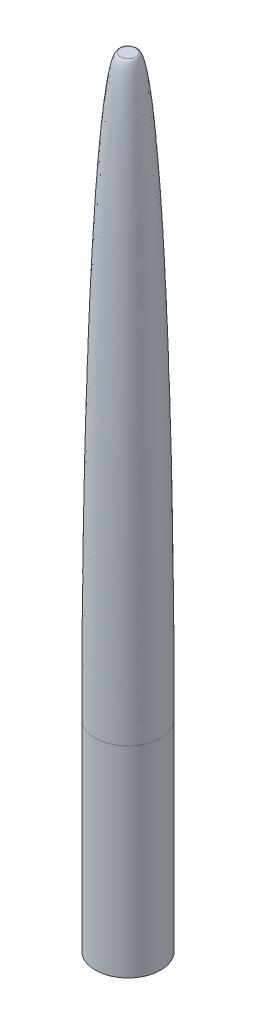
ISO-10303-21;
HEADER;
FILE_DESCRIPTION(('STEP AP214'),'2;1');
FILE_NAME('part.step','',(''),(''),'','','');
FILE_SCHEMA(('AUTOMOTIVE_DESIGN { 1 0 10303 214 1 1 1 1 }'));
ENDSEC;
DATA;
#1=APPLICATION_CONTEXT('core data for automotive mechanical design processes');
#2=APPLICATION_PROTOCOL_DEFINITION('international standard','automotive_design',2000,#1);
#3=PRODUCT_CONTEXT('',#1,'mechanical');
#4=PRODUCT('Part','Part','',(#3));
#5=PRODUCT_RELATED_PRODUCT_CATEGORY('part','',(#4));
#6=PRODUCT_DEFINITION_FORMATION('','',#4);
#7=PRODUCT_DEFINITION_CONTEXT('part definition',#1,'design');
#8=PRODUCT_DEFINITION('design','',#6,#7);
#9=PRODUCT_DEFINITION_SHAPE('','',#8);
#10=(LENGTH_UNIT() NAMED_UNIT(*) SI_UNIT(.MILLI.,.METRE.));
#11=(NAMED_UNIT(*) PLANE_ANGLE_UNIT() SI_UNIT($,.RADIAN.));
#12=(NAMED_UNIT(*) SI_UNIT($,.STERADIAN.) SOLID_ANGLE_UNIT());
#13=UNCERTAINTY_MEASURE_WITH_UNIT(LENGTH_MEASURE(1.E-05),#10,'distance_accuracy_value','');
#14=(GEOMETRIC_REPRESENTATION_CONTEXT(3) GLOBAL_UNCERTAINTY_ASSIGNED_CONTEXT((#13)) GLOBAL_UNIT_ASSIGNED_CONTEXT((#10,
#11,#12)) REPRESENTATION_CONTEXT('',''));
#15=CARTESIAN_POINT('',(0.,0.,0.));
#16=DIRECTION('',(0.,0.,1.));
#17=DIRECTION('',(1.,0.,0.));
#18=AXIS2_PLACEMENT_3D('',#15,#16,#17);
#19=CARTESIAN_POINT('',(0.,77.5,0.));
#20=DIRECTION('',(0.,-1.,0.));
#21=DIRECTION('',(0.,0.,-1.));
#22=AXIS2_PLACEMENT_3D('',#19,#20,#21);
#23=CYLINDRICAL_SURFACE('',#22,6.5);
#24=CARTESIAN_POINT('',(0.,-37.5,6.5));
#25=CARTESIAN_POINT('',(1.70169589464314,-37.5,6.5));
#26=CARTESIAN_POINT('',(3.39291337109326,-37.5,5.79947478433186));
#27=CARTESIAN_POINT('',(5.79947478433186,-37.5,3.39291337109326));
#28=CARTESIAN_POINT('',(6.5,-37.5,1.70169589464292));
#29=CARTESIAN_POINT('',(6.5,-37.5,-1.70169589464292));
#30=CARTESIAN_POINT('',(5.7994747843318,-37.5,-3.39291337109332));
#31=CARTESIAN_POINT('',(3.39291337109331,-37.5,-5.7994747843318));
#32=CARTESIAN_POINT('',(1.70169589464292,-37.5,-6.5));
#33=CARTESIAN_POINT('',(-1.70169589464292,-37.5,-6.5));
#34=CARTESIAN_POINT('',(-3.39291337109341,-37.5,-5.79947478433171));
#35=CARTESIAN_POINT('',(-5.79947478433172,-37.5,-3.3929133710934));
#36=CARTESIAN_POINT('',(-6.5,-37.5,-1.70169589464291));
#37=CARTESIAN_POINT('',(-6.5,-37.5,1.70169589464293));
#38=CARTESIAN_POINT('',(-5.79947478433181,-37.5,3.3929133710933));
#39=CARTESIAN_POINT('',(-3.39291337109333,-37.5,5.79947478433179));
#40=CARTESIAN_POINT('',(-1.70169589464314,-37.5,6.5));
#41=CARTESIAN_POINT('',(0.,-37.5,6.5));
#42=(BOUNDED_CURVE() B_SPLINE_CURVE(3,(#24,#25,#26,#27,#28,#29,#30,#31,#32,#33,#34,#35,#36,#37,
#38,#39,#40,#41),.UNSPECIFIED.,.T.,.F.) B_SPLINE_CURVE_WITH_KNOTS((4,2,2,2,2,2,2,2,4),(0.,
0.785398163397448,1.5707963267949,2.35619449019234,3.14159265358979,3.92699081698724,
4.71238898038469,5.49778714378214,6.28318530717959),
.UNSPECIFIED.) CURVE() GEOMETRIC_REPRESENTATION_ITEM() RATIONAL_B_SPLINE_CURVE((1.,1.,1.,1.,1.,
1.,1.,1.,1.,1.,1.,1.,1.,1.,1.,1.,1.,1.)) REPRESENTATION_ITEM(''));
#43=CARTESIAN_POINT('',(0.,-37.5,6.5));
#44=VERTEX_POINT('',#43);
#45=EDGE_CURVE('E11',#44,#44,#42,.F.);
#46=ORIENTED_EDGE('',*,*,#45,.T.);
#47=EDGE_LOOP('',(#46));
#48=FACE_BOUND('',#47,.T.);
#49=CARTESIAN_POINT('',(0.,-77.5,0.));
#50=DIRECTION('',(0.,1.,0.));
#51=DIRECTION('',(0.,0.,1.));
#52=AXIS2_PLACEMENT_3D('',#49,#50,#51);
#53=CIRCLE('',#52,6.5);
#54=CARTESIAN_POINT('',(0.,-77.5,6.5));
#55=VERTEX_POINT('',#54);
#56=EDGE_CURVE('E68',#55,#55,#53,.T.);
#57=ORIENTED_EDGE('',*,*,#56,.T.);
#58=EDGE_LOOP('',(#57));
#59=FACE_BOUND('',#58,.T.);
#60=ADVANCED_FACE('F48',(#48,#59),#23,.T.);
#61=CARTESIAN_POINT('',(0.,77.5,0.));
#62=DIRECTION('',(0.,1.,0.));
#63=DIRECTION('',(0.,0.,1.));
#64=AXIS2_PLACEMENT_3D('',#61,#62,#63);
#65=PLANE('',#64);
#66=CARTESIAN_POINT('',(0.,77.5,1.5));
#67=CARTESIAN_POINT('',(-0.392699052609955,77.5,1.5));
#68=CARTESIAN_POINT('',(-0.782980008713843,77.5,1.3383403348458));
#69=CARTESIAN_POINT('',(-1.33834033484581,77.5,0.782980008713836));
#70=CARTESIAN_POINT('',(-1.5,77.5,0.392699052609906));
#71=CARTESIAN_POINT('',(-1.5,77.5,-0.392699052609902));
#72=CARTESIAN_POINT('',(-1.33834033484576,77.5,-0.782980008713839));
#73=CARTESIAN_POINT('',(-0.782980008713883,77.5,-1.3383403348458));
#74=CARTESIAN_POINT('',(-0.392699052609904,77.5,-1.5));
#75=CARTESIAN_POINT('',(0.392699052609904,77.5,-1.5));
#76=CARTESIAN_POINT('',(0.782980008713839,77.5,-1.3383403348458));
#77=CARTESIAN_POINT('',(1.3383403348458,77.5,-0.78298000871384));
#78=CARTESIAN_POINT('',(1.5,77.5,-0.392699052609904));
#79=CARTESIAN_POINT('',(1.5,77.5,0.392699052609904));
#80=CARTESIAN_POINT('',(1.3383403348458,77.5,0.782980008713801));
#81=CARTESIAN_POINT('',(0.782980008713843,77.5,1.33834033484584));
#82=CARTESIAN_POINT('',(0.392699052609955,77.5,1.5));
#83=CARTESIAN_POINT('',(0.,77.5,1.5));
#84=(BOUNDED_CURVE() B_SPLINE_CURVE(3,(#66,#67,#68,#69,#70,#71,#72,#73,#74,#75,#76,#77,#78,#79,
#80,#81,#82,#83),.UNSPECIFIED.,.T.,.F.) B_SPLINE_CURVE_WITH_KNOTS((4,2,2,2,2,2,2,2,4),(0.,
0.785398163397448,1.5707963267949,2.35619449019234,3.14159265358979,3.92699081698724,
4.71238898038469,5.49778714378214,6.28318530717959),
.UNSPECIFIED.) CURVE() GEOMETRIC_REPRESENTATION_ITEM() RATIONAL_B_SPLINE_CURVE((1.,1.,1.,1.,1.,
1.,1.,1.,1.,1.,1.,1.,1.,1.,1.,1.,1.,1.)) REPRESENTATION_ITEM(''));
#85=CARTESIAN_POINT('',(0.,77.5,1.5));
#86=VERTEX_POINT('',#85);
#87=EDGE_CURVE('E62',#86,#86,#84,.F.);
#88=ORIENTED_EDGE('',*,*,#87,.T.);
#89=EDGE_LOOP('',(#88));
#90=FACE_BOUND('',#89,.T.);
#91=ADVANCED_FACE('F82',(#90),#65,.T.);
#92=CARTESIAN_POINT('',(0.,-77.5,0.));
#93=DIRECTION('',(0.,1.,0.));
#94=DIRECTION('',(0.,0.,1.));
#95=AXIS2_PLACEMENT_3D('',#92,#93,#94);
#96=PLANE('',#95);
#97=ORIENTED_EDGE('',*,*,#56,.F.);
#98=EDGE_LOOP('',(#97));
#99=FACE_BOUND('',#98,.T.);
#100=ADVANCED_FACE('F91',(#99),#96,.F.);
#101=CARTESIAN_POINT('',(0.,77.5,1.5));
#102=CARTESIAN_POINT('',(0.392699052609955,77.5,1.5));
#103=CARTESIAN_POINT('',(0.782980008713843,77.5,1.33834033484584));
#104=CARTESIAN_POINT('',(1.3383403348458,77.5,0.782980008713801));
#105=CARTESIAN_POINT('',(1.5,77.5,0.392699052609904));
#106=CARTESIAN_POINT('',(1.5,77.5,-0.392699052609904));
#107=CARTESIAN_POINT('',(1.3383403348458,77.5,-0.78298000871384));
#108=CARTESIAN_POINT('',(0.782980008713839,77.5,-1.3383403348458));
#109=CARTESIAN_POINT('',(0.392699052609904,77.5,-1.5));
#110=CARTESIAN_POINT('',(-0.392699052609904,77.5,-1.5));
#111=CARTESIAN_POINT('',(-0.782980008713883,77.5,-1.3383403348458));
#112=CARTESIAN_POINT('',(-1.33834033484576,77.5,-0.782980008713839));
#113=CARTESIAN_POINT('',(-1.5,77.5,-0.392699052609902));
#114=CARTESIAN_POINT('',(-1.5,77.5,0.392699052609906));
#115=CARTESIAN_POINT('',(-1.33834033484581,77.5,0.782980008713836));
#116=CARTESIAN_POINT('',(-0.782980008713843,77.5,1.3383403348458));
#117=CARTESIAN_POINT('',(-0.392699052609955,77.5,1.5));
#118=CARTESIAN_POINT('',(0.,77.5,1.5));
#119=CARTESIAN_POINT('',(0.,77.5,6.5));
#120=CARTESIAN_POINT('',(1.70169589464314,77.4999999999918,6.49999999999949));
#121=CARTESIAN_POINT('',(3.39291337109335,77.5000000000055,5.79947478433194));
#122=CARTESIAN_POINT('',(5.79947478433177,77.4999999999945,3.39291337109318));
#123=CARTESIAN_POINT('',(6.5,77.5,1.70169589464292));
#124=CARTESIAN_POINT('',(6.5,77.5,-1.70169589464292));
#125=CARTESIAN_POINT('',(5.7994747843318,77.5000000000027,-3.39291337109315));
#126=CARTESIAN_POINT('',(3.39291337109331,77.4999999999973,-5.79947478433198));
#127=CARTESIAN_POINT('',(1.70169589464292,77.5,-6.5));
#128=CARTESIAN_POINT('',(-1.70169589464292,77.5,-6.5));
#129=CARTESIAN_POINT('',(-3.39291337109332,77.5000000000055,-5.7994747843318));
#130=CARTESIAN_POINT('',(-5.7994747843318,77.4999999999945,-3.39291337109331));
#131=CARTESIAN_POINT('',(-6.50000000000017,77.5000000000027,-1.70169589464291));
#132=CARTESIAN_POINT('',(-6.49999999999983,77.4999999999973,1.70169589464293));
#133=CARTESIAN_POINT('',(-5.79947478433182,77.4999999999973,3.3929133710933));
#134=CARTESIAN_POINT('',(-3.39291337109333,77.5000000000027,5.79947478433179));
#135=CARTESIAN_POINT('',(-1.70169589464314,77.5000000000082,6.50000000000051));
#136=CARTESIAN_POINT('',(0.,77.5,6.5));
#137=CARTESIAN_POINT('',(0.,-37.5,6.5));
#138=CARTESIAN_POINT('',(1.70169589464314,-37.5,6.5));
#139=CARTESIAN_POINT('',(3.39291337109326,-37.5,5.79947478433186));
#140=CARTESIAN_POINT('',(5.79947478433186,-37.5,3.39291337109326));
#141=CARTESIAN_POINT('',(6.5,-37.5,1.70169589464292));
#142=CARTESIAN_POINT('',(6.5,-37.5,-1.70169589464292));
#143=CARTESIAN_POINT('',(5.7994747843318,-37.5,-3.39291337109332));
#144=CARTESIAN_POINT('',(3.39291337109331,-37.5,-5.7994747843318));
#145=CARTESIAN_POINT('',(1.70169589464292,-37.5,-6.5));
#146=CARTESIAN_POINT('',(-1.70169589464292,-37.5,-6.5));
#147=CARTESIAN_POINT('',(-3.39291337109341,-37.5,-5.79947478433171));
#148=CARTESIAN_POINT('',(-5.79947478433172,-37.5,-3.3929133710934));
#149=CARTESIAN_POINT('',(-6.5,-37.5,-1.70169589464291));
#150=CARTESIAN_POINT('',(-6.5,-37.5,1.70169589464293));
#151=CARTESIAN_POINT('',(-5.79947478433181,-37.5,3.3929133710933));
#152=CARTESIAN_POINT('',(-3.39291337109333,-37.5,5.79947478433179));
#153=CARTESIAN_POINT('',(-1.70169589464314,-37.5,6.5));
#154=CARTESIAN_POINT('',(0.,-37.5,6.5));
#155=(BOUNDED_SURFACE() B_SPLINE_SURFACE(2,3,((#101,#102,#103,#104,#105,#106,#107,#108,#109,
#110,#111,#112,#113,#114,#115,#116,#117,#118),(#119,#120,#121,#122,#123,#124,#125,#126,#127,
#128,#129,#130,#131,#132,#133,#134,#135,#136),(#137,#138,#139,#140,#141,#142,#143,#144,#145,
#146,#147,#148,#149,#150,#151,#152,#153,#154)),.UNSPECIFIED.,.F.,.T.,
.F.) B_SPLINE_SURFACE_WITH_KNOTS((3,3),(4,2,2,2,2,2,2,2,4),(0.,1.),(0.,0.785398163397448,
1.5707963267949,2.35619449019234,3.14159265358979,3.92699081698724,4.71238898038469,
5.49778714378214,6.28318530717959),
.UNSPECIFIED.) GEOMETRIC_REPRESENTATION_ITEM() RATIONAL_B_SPLINE_SURFACE(((1.,1.,1.,1.,1.,1.,1.,
1.,1.,1.,1.,1.,1.,1.,1.,1.,1.,1.),(0.707106781186548,0.707106781186548,0.707106781186548,
0.707106781186548,0.707106781186548,0.707106781186548,0.707106781186548,0.707106781186548,
0.707106781186548,0.707106781186548,0.707106781186548,0.707106781186548,0.707106781186548,
0.707106781186548,0.707106781186548,0.707106781186548,0.707106781186548,0.707106781186548),(1.,
1.,1.,1.,1.,1.,1.,1.,1.,1.,1.,1.,1.,1.,1.,1.,1.,1.))) REPRESENTATION_ITEM('') SURFACE());
#156=ORIENTED_EDGE('',*,*,#45,.F.);
#157=EDGE_LOOP('',(#156));
#158=FACE_BOUND('',#157,.T.);
#159=ORIENTED_EDGE('',*,*,#87,.F.);
#160=EDGE_LOOP('',(#159));
#161=FACE_BOUND('',#160,.T.);
#162=ADVANCED_FACE('F51',(#158,#161),#155,.T.);
#163=CLOSED_SHELL('',(#60,#91,#100,#162));
#164=MANIFOLD_SOLID_BREP('B2',#163);
#165=ADVANCED_BREP_SHAPE_REPRESENTATION('',(#18,#164),#14);
#166=SHAPE_DEFINITION_REPRESENTATION(#9,#165);
ENDSEC;
END-ISO-10303-21;
